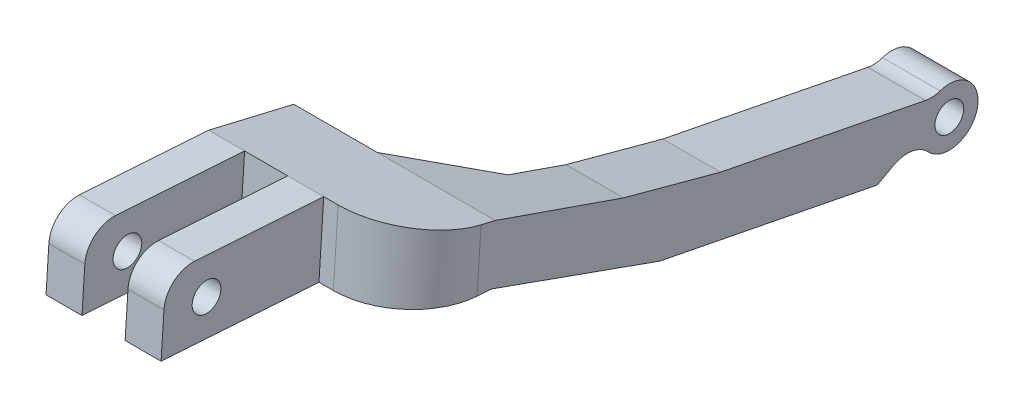
ISO-10303-21;
HEADER;
FILE_DESCRIPTION(('STEP AP214'),'2;1');
FILE_NAME('part.step','',(''),(''),'','','');
FILE_SCHEMA(('AUTOMOTIVE_DESIGN { 1 0 10303 214 1 1 1 1 }'));
ENDSEC;
DATA;
#1=APPLICATION_CONTEXT('core data for automotive mechanical design processes');
#2=APPLICATION_PROTOCOL_DEFINITION('international standard','automotive_design',2000,#1);
#3=PRODUCT_CONTEXT('',#1,'mechanical');
#4=PRODUCT('Part','Part','',(#3));
#5=PRODUCT_RELATED_PRODUCT_CATEGORY('part','',(#4));
#6=PRODUCT_DEFINITION_FORMATION('','',#4);
#7=PRODUCT_DEFINITION_CONTEXT('part definition',#1,'design');
#8=PRODUCT_DEFINITION('design','',#6,#7);
#9=PRODUCT_DEFINITION_SHAPE('','',#8);
#10=(LENGTH_UNIT() NAMED_UNIT(*) SI_UNIT(.MILLI.,.METRE.));
#11=(NAMED_UNIT(*) PLANE_ANGLE_UNIT() SI_UNIT($,.RADIAN.));
#12=(NAMED_UNIT(*) SI_UNIT($,.STERADIAN.) SOLID_ANGLE_UNIT());
#13=UNCERTAINTY_MEASURE_WITH_UNIT(LENGTH_MEASURE(1.E-05),#10,'distance_accuracy_value','');
#14=(GEOMETRIC_REPRESENTATION_CONTEXT(3) GLOBAL_UNCERTAINTY_ASSIGNED_CONTEXT((#13)) GLOBAL_UNIT_ASSIGNED_CONTEXT((#10,
#11,#12)) REPRESENTATION_CONTEXT('',''));
#15=CARTESIAN_POINT('',(0.,0.,0.));
#16=DIRECTION('',(0.,0.,1.));
#17=DIRECTION('',(1.,0.,0.));
#18=AXIS2_PLACEMENT_3D('',#15,#16,#17);
#19=CARTESIAN_POINT('',(-2.,2.73863938441032,41.0516777291584));
#20=DIRECTION('',(0.,0.0665640397080232,0.997782154890409));
#21=DIRECTION('',(0.,-0.997782154890409,0.0665640397080232));
#22=AXIS2_PLACEMENT_3D('',#19,#20,#21);
#23=PLANE('',#22);
#24=DIRECTION('',(1.,0.,0.));
#25=VECTOR('',#24,1.);
#26=CARTESIAN_POINT('',(-2.,8.79072533125629,40.64793099215));
#27=LINE('',#26,#25);
#28=CARTESIAN_POINT('',(-9.5,8.79072533125629,40.64793099215));
#29=VERTEX_POINT('',#28);
#30=CARTESIAN_POINT('',(-6.5,8.79072533125629,40.64793099215));
#31=VERTEX_POINT('',#30);
#32=EDGE_CURVE('E342',#29,#31,#27,.T.);
#33=ORIENTED_EDGE('',*,*,#32,.T.);
#34=DIRECTION('',(0.,-0.997782154890409,0.0665640397080232));
#35=VECTOR('',#34,1.);
#36=CARTESIAN_POINT('',(-6.5,2.73863938441032,41.0516777291584));
#37=LINE('',#36,#35);
#38=CARTESIAN_POINT('',(-6.5,13.7796361057083,40.3151107936098));
#39=VERTEX_POINT('',#38);
#40=EDGE_CURVE('E399',#39,#31,#37,.T.);
#41=ORIENTED_EDGE('',*,*,#40,.F.);
#42=DIRECTION('',(1.,0.,0.));
#43=VECTOR('',#42,1.);
#44=CARTESIAN_POINT('',(-2.,13.7796361057083,40.3151107936098));
#45=LINE('',#44,#43);
#46=CARTESIAN_POINT('',(-9.5,13.7796361057083,40.3151107936098));
#47=VERTEX_POINT('',#46);
#48=EDGE_CURVE('E345',#47,#39,#45,.T.);
#49=ORIENTED_EDGE('',*,*,#48,.F.);
#50=DIRECTION('',(0.,-0.997782154890409,0.0665640397080232));
#51=VECTOR('',#50,1.);
#52=CARTESIAN_POINT('',(-9.5,2.73863938441032,41.0516777291584));
#53=LINE('',#52,#51);
#54=EDGE_CURVE('E265',#47,#29,#53,.T.);
#55=ORIENTED_EDGE('',*,*,#54,.T.);
#56=EDGE_LOOP('',(#33,#41,#49,#55));
#57=FACE_BOUND('',#56,.T.);
#58=ADVANCED_FACE('F43',(#57),#23,.T.);
#59=CARTESIAN_POINT('',(-2.,0.,0.));
#60=DIRECTION('',(1.,0.,0.));
#61=DIRECTION('',(0.,0.,-1.));
#62=AXIS2_PLACEMENT_3D('',#59,#60,#61);
#63=PLANE('',#62);
#64=CARTESIAN_POINT('',(-2.,2.82842712474617,2.82842712474621));
#65=DIRECTION('',(1.,0.,0.));
#66=DIRECTION('',(0.,0.,-1.));
#67=AXIS2_PLACEMENT_3D('',#64,#65,#66);
#68=CIRCLE('',#67,1.);
#69=CARTESIAN_POINT('',(-2.,2.82842712474617,1.82842712474621));
#70=VERTEX_POINT('',#69);
#71=EDGE_CURVE('E325',#70,#70,#68,.T.);
#72=ORIENTED_EDGE('',*,*,#71,.T.);
#73=EDGE_LOOP('',(#72));
#74=FACE_BOUND('',#73,.T.);
#75=DIRECTION('',(0.,-0.335768666523311,-0.941944479564033));
#76=VECTOR('',#75,1.);
#77=CARTESIAN_POINT('',(-2.,-3.51720209807534,1.2537535746378));
#78=LINE('',#77,#76);
#79=CARTESIAN_POINT('',(-2.,6.64655444127387,29.7665223895568));
#80=VERTEX_POINT('',#79);
#81=CARTESIAN_POINT('',(-2.,4.21314419530496,22.939985025488));
#82=VERTEX_POINT('',#81);
#83=EDGE_CURVE('E312',#80,#82,#78,.T.);
#84=ORIENTED_EDGE('',*,*,#83,.F.);
#85=DIRECTION('',(0.,0.997782154890409,-0.0665640397080232));
#86=VECTOR('',#85,1.);
#87=CARTESIAN_POINT('',(-2.,12.0496495140297,29.4060711295234));
#88=LINE('',#87,#86);
#89=CARTESIAN_POINT('',(-2.,10.6823280378961,29.4972878751676));
#90=VERTEX_POINT('',#89);
#91=EDGE_CURVE('E366',#80,#90,#88,.T.);
#92=ORIENTED_EDGE('',*,*,#91,.T.);
#93=DIRECTION('',(0.,-0.327934825038129,-0.944700349596216));
#94=VECTOR('',#93,1.);
#95=CARTESIAN_POINT('',(-2.,0.395273106266088,-0.13721156872764));
#96=LINE('',#95,#94);
#97=CARTESIAN_POINT('',(-2.,9.28430122630332,25.469913175018));
#98=VERTEX_POINT('',#97);
#99=EDGE_CURVE('E310',#90,#98,#96,.T.);
#100=ORIENTED_EDGE('',*,*,#99,.T.);
#101=DIRECTION('',(0.,-0.261237027153609,-0.965274684037629));
#102=VECTOR('',#101,1.);
#103=CARTESIAN_POINT('',(-2.,2.22806298460891,-0.602991625115011));
#104=LINE('',#103,#102);
#105=CARTESIAN_POINT('',(-2.,7.46200384373997,18.7364973597243));
#106=VERTEX_POINT('',#105);
#107=EDGE_CURVE('E360',#106,#98,#104,.F.);
#108=ORIENTED_EDGE('',*,*,#107,.F.);
#109=DIRECTION('',(0.,0.193266508732253,0.981146297247483));
#110=VECTOR('',#109,1.);
#111=CARTESIAN_POINT('',(-2.,3.63041791669355,-0.715120872357937));
#112=LINE('',#111,#110);
#113=CARTESIAN_POINT('',(-2.,4.65637088782305,4.49328261863853));
#114=VERTEX_POINT('',#113);
#115=EDGE_CURVE('E307',#114,#106,#112,.T.);
#116=ORIENTED_EDGE('',*,*,#115,.F.);
#117=CARTESIAN_POINT('',(-2.,6.61866348231801,4.10674960117403));
#118=DIRECTION('',(1.,0.,0.));
#119=DIRECTION('',(0.,0.,-1.));
#120=AXIS2_PLACEMENT_3D('',#117,#118,#119);
#121=CIRCLE('',#120,2.);
#122=CARTESIAN_POINT('',(-2.,4.72354530353209,3.46758836296012));
#123=VERTEX_POINT('',#122);
#124=EDGE_CURVE('E305',#114,#123,#121,.T.);
#125=ORIENTED_EDGE('',*,*,#124,.T.);
#126=CARTESIAN_POINT('',(-2.,2.82842712474617,2.82842712474621));
#127=DIRECTION('',(1.,0.,0.));
#128=DIRECTION('',(0.,0.,-1.));
#129=AXIS2_PLACEMENT_3D('',#126,#127,#128);
#130=CIRCLE('',#129,2.);
#131=CARTESIAN_POINT('',(-2.,1.46299909190755,4.28979849682739));
#132=VERTEX_POINT('',#131);
#133=EDGE_CURVE('E322',#132,#123,#130,.T.);
#134=ORIENTED_EDGE('',*,*,#133,.F.);
#135=CARTESIAN_POINT('',(-2.,0.0975710590689317,5.75116986890858));
#136=DIRECTION('',(1.,0.,0.));
#137=DIRECTION('',(0.,0.,-1.));
#138=AXIS2_PLACEMENT_3D('',#135,#136,#137);
#139=CIRCLE('',#138,2.);
#140=CARTESIAN_POINT('',(-2.,1.84923303121626,6.71640576511889));
#141=VERTEX_POINT('',#140);
#142=EDGE_CURVE('E320',#132,#141,#139,.T.);
#143=ORIENTED_EDGE('',*,*,#142,.T.);
#144=DIRECTION('',(0.,0.482617948105157,-0.875830986073665));
#145=VECTOR('',#144,1.);
#146=CARTESIAN_POINT('',(-2.,4.25747884786671,2.34604134625321));
#147=LINE('',#146,#145);
#148=CARTESIAN_POINT('',(-2.,1.23646472846601,7.8284271247462));
#149=VERTEX_POINT('',#148);
#150=EDGE_CURVE('E317',#149,#141,#147,.T.);
#151=ORIENTED_EDGE('',*,*,#150,.F.);
#152=DIRECTION('',(0.,0.193266508732253,0.981146297247483));
#153=VECTOR('',#152,1.);
#154=CARTESIAN_POINT('',(-2.,-0.294167272296385,0.0579451625710735));
#155=LINE('',#154,#153);
#156=EDGE_CURVE('E314',#149,#82,#155,.T.);
#157=ORIENTED_EDGE('',*,*,#156,.T.);
#158=EDGE_LOOP('',(#84,#92,#100,#108,#116,#125,#134,#143,#151,#157));
#159=FACE_BOUND('',#158,.T.);
#160=ADVANCED_FACE('F420',(#74,#159),#63,.F.);
#161=CARTESIAN_POINT('',(-2.,9.28430122630331,25.469913175018));
#162=DIRECTION('',(0.,-0.965274684037629,0.261237027153608));
#163=DIRECTION('',(-1.,0.,0.));
#164=AXIS2_PLACEMENT_3D('',#161,#162,#163);
#165=PLANE('',#164);
#166=DIRECTION('',(-1.,0.,0.));
#167=VECTOR('',#166,1.);
#168=CARTESIAN_POINT('',(-2.,9.28430122630331,25.469913175018));
#169=LINE('',#168,#167);
#170=CARTESIAN_POINT('',(2.,9.28430122630332,25.469913175018));
#171=VERTEX_POINT('',#170);
#172=EDGE_CURVE('E331',#171,#98,#169,.T.);
#173=ORIENTED_EDGE('',*,*,#172,.F.);
#174=DIRECTION('',(0.,0.261237027153609,0.965274684037629));
#175=VECTOR('',#174,1.);
#176=CARTESIAN_POINT('',(2.,9.28430122630331,25.469913175018));
#177=LINE('',#176,#175);
#178=CARTESIAN_POINT('',(2.,7.46200384373997,18.7364973597243));
#179=VERTEX_POINT('',#178);
#180=EDGE_CURVE('E358',#171,#179,#177,.F.);
#181=ORIENTED_EDGE('',*,*,#180,.T.);
#182=DIRECTION('',(1.,0.,0.));
#183=VECTOR('',#182,1.);
#184=CARTESIAN_POINT('',(-2.,7.46200384373995,18.7364973597242));
#185=LINE('',#184,#183);
#186=EDGE_CURVE('E355',#106,#179,#185,.T.);
#187=ORIENTED_EDGE('',*,*,#186,.F.);
#188=ORIENTED_EDGE('',*,*,#107,.T.);
#189=EDGE_LOOP('',(#173,#181,#187,#188));
#190=FACE_BOUND('',#189,.T.);
#191=ADVANCED_FACE('F427',(#190),#165,.F.);
#192=CARTESIAN_POINT('',(-2.,6.61866348231801,4.10674960117403));
#193=DIRECTION('',(1.,0.,0.));
#194=DIRECTION('',(0.,0.,-1.));
#195=AXIS2_PLACEMENT_3D('',#192,#193,#194);
#196=CYLINDRICAL_SURFACE('',#195,2.);
#197=DIRECTION('',(1.,0.,0.));
#198=VECTOR('',#197,1.);
#199=CARTESIAN_POINT('',(-2.,4.65637088782305,4.49328261863853));
#200=LINE('',#199,#198);
#201=CARTESIAN_POINT('',(2.,4.65637088782305,4.49328261863853));
#202=VERTEX_POINT('',#201);
#203=EDGE_CURVE('E328',#114,#202,#200,.T.);
#204=ORIENTED_EDGE('',*,*,#203,.T.);
#205=CARTESIAN_POINT('',(2.,6.61866348231801,4.10674960117403));
#206=DIRECTION('',(1.,0.,0.));
#207=DIRECTION('',(0.,0.,-1.));
#208=AXIS2_PLACEMENT_3D('',#205,#206,#207);
#209=CIRCLE('',#208,2.);
#210=CARTESIAN_POINT('',(2.,4.72354530353209,3.46758836296012));
#211=VERTEX_POINT('',#210);
#212=EDGE_CURVE('E274',#202,#211,#209,.T.);
#213=ORIENTED_EDGE('',*,*,#212,.T.);
#214=DIRECTION('',(1.,0.,0.));
#215=VECTOR('',#214,1.);
#216=CARTESIAN_POINT('',(-2.,4.72354530353209,3.46758836296012));
#217=LINE('',#216,#215);
#218=EDGE_CURVE('E329',#123,#211,#217,.T.);
#219=ORIENTED_EDGE('',*,*,#218,.F.);
#220=ORIENTED_EDGE('',*,*,#124,.F.);
#221=EDGE_LOOP('',(#204,#213,#219,#220));
#222=FACE_BOUND('',#221,.T.);
#223=ADVANCED_FACE('F525',(#222),#196,.F.);
#224=CARTESIAN_POINT('',(-2.,2.82842712474617,2.82842712474621));
#225=DIRECTION('',(1.,0.,0.));
#226=DIRECTION('',(0.,0.,-1.));
#227=AXIS2_PLACEMENT_3D('',#224,#225,#226);
#228=CYLINDRICAL_SURFACE('',#227,2.);
#229=ORIENTED_EDGE('',*,*,#218,.T.);
#230=CARTESIAN_POINT('',(2.,2.82842712474617,2.82842712474621));
#231=DIRECTION('',(1.,0.,0.));
#232=DIRECTION('',(0.,0.,-1.));
#233=AXIS2_PLACEMENT_3D('',#230,#231,#232);
#234=CIRCLE('',#233,2.);
#235=CARTESIAN_POINT('',(2.,1.46299909190755,4.28979849682739));
#236=VERTEX_POINT('',#235);
#237=EDGE_CURVE('E299',#236,#211,#234,.T.);
#238=ORIENTED_EDGE('',*,*,#237,.F.);
#239=DIRECTION('',(1.,0.,0.));
#240=VECTOR('',#239,1.);
#241=CARTESIAN_POINT('',(-2.,1.46299909190755,4.28979849682739));
#242=LINE('',#241,#240);
#243=EDGE_CURVE('E332',#132,#236,#242,.T.);
#244=ORIENTED_EDGE('',*,*,#243,.F.);
#245=ORIENTED_EDGE('',*,*,#133,.T.);
#246=EDGE_LOOP('',(#229,#238,#244,#245));
#247=FACE_BOUND('',#246,.T.);
#248=ADVANCED_FACE('F521',(#247),#228,.T.);
#249=CARTESIAN_POINT('',(-2.,0.0975710590689317,5.75116986890858));
#250=DIRECTION('',(1.,0.,0.));
#251=DIRECTION('',(0.,0.,-1.));
#252=AXIS2_PLACEMENT_3D('',#249,#250,#251);
#253=CYLINDRICAL_SURFACE('',#252,2.);
#254=ORIENTED_EDGE('',*,*,#243,.T.);
#255=CARTESIAN_POINT('',(2.,0.0975710590689317,5.75116986890858));
#256=DIRECTION('',(1.,0.,0.));
#257=DIRECTION('',(0.,0.,-1.));
#258=AXIS2_PLACEMENT_3D('',#255,#256,#257);
#259=CIRCLE('',#258,2.);
#260=CARTESIAN_POINT('',(2.,1.84923303121626,6.71640576511889));
#261=VERTEX_POINT('',#260);
#262=EDGE_CURVE('E296',#236,#261,#259,.T.);
#263=ORIENTED_EDGE('',*,*,#262,.T.);
#264=DIRECTION('',(1.,0.,0.));
#265=VECTOR('',#264,1.);
#266=CARTESIAN_POINT('',(-2.,1.84923303121626,6.71640576511889));
#267=LINE('',#266,#265);
#268=EDGE_CURVE('E334',#141,#261,#267,.T.);
#269=ORIENTED_EDGE('',*,*,#268,.F.);
#270=ORIENTED_EDGE('',*,*,#142,.F.);
#271=EDGE_LOOP('',(#254,#263,#269,#270));
#272=FACE_BOUND('',#271,.T.);
#273=ADVANCED_FACE('F524',(#272),#253,.F.);
#274=CARTESIAN_POINT('',(-2.,4.25747884786671,2.34604134625321));
#275=DIRECTION('',(0.,-0.875830986073665,-0.482617948105157));
#276=DIRECTION('',(0.,0.482617948105157,-0.875830986073665));
#277=AXIS2_PLACEMENT_3D('',#274,#275,#276);
#278=PLANE('',#277);
#279=ORIENTED_EDGE('',*,*,#268,.T.);
#280=DIRECTION('',(0.,0.482617948105157,-0.875830986073665));
#281=VECTOR('',#280,1.);
#282=CARTESIAN_POINT('',(2.,4.25747884786671,2.34604134625321));
#283=LINE('',#282,#281);
#284=CARTESIAN_POINT('',(2.,1.23646472846601,7.8284271247462));
#285=VERTEX_POINT('',#284);
#286=EDGE_CURVE('E293',#285,#261,#283,.T.);
#287=ORIENTED_EDGE('',*,*,#286,.F.);
#288=DIRECTION('',(1.,0.,0.));
#289=VECTOR('',#288,1.);
#290=CARTESIAN_POINT('',(-2.,1.23646472846601,7.8284271247462));
#291=LINE('',#290,#289);
#292=EDGE_CURVE('E336',#149,#285,#291,.T.);
#293=ORIENTED_EDGE('',*,*,#292,.F.);
#294=ORIENTED_EDGE('',*,*,#150,.T.);
#295=EDGE_LOOP('',(#279,#287,#293,#294));
#296=FACE_BOUND('',#295,.T.);
#297=ADVANCED_FACE('F529',(#296),#278,.T.);
#298=CARTESIAN_POINT('',(-2.,-0.294167272296385,0.0579451625710735));
#299=DIRECTION('',(0.,0.981146297247483,-0.193266508732253));
#300=DIRECTION('',(0.,0.193266508732253,0.981146297247483));
#301=AXIS2_PLACEMENT_3D('',#298,#299,#300);
#302=PLANE('',#301);
#303=ORIENTED_EDGE('',*,*,#292,.T.);
#304=DIRECTION('',(0.,0.193266508732253,0.981146297247483));
#305=VECTOR('',#304,1.);
#306=CARTESIAN_POINT('',(2.,-0.294167272296385,0.0579451625710735));
#307=LINE('',#306,#305);
#308=CARTESIAN_POINT('',(2.,4.21314419530496,22.939985025488));
#309=VERTEX_POINT('',#308);
#310=EDGE_CURVE('E290',#285,#309,#307,.T.);
#311=ORIENTED_EDGE('',*,*,#310,.T.);
#312=DIRECTION('',(1.,0.,0.));
#313=VECTOR('',#312,1.);
#314=CARTESIAN_POINT('',(-2.,4.21314419530496,22.939985025488));
#315=LINE('',#314,#313);
#316=EDGE_CURVE('E338',#82,#309,#315,.T.);
#317=ORIENTED_EDGE('',*,*,#316,.F.);
#318=ORIENTED_EDGE('',*,*,#156,.F.);
#319=EDGE_LOOP('',(#303,#311,#317,#318));
#320=FACE_BOUND('',#319,.T.);
#321=ADVANCED_FACE('F533',(#320),#302,.F.);
#322=CARTESIAN_POINT('',(-2.,-3.51720209807534,1.2537535746378));
#323=DIRECTION('',(0.,-0.941944479564033,0.335768666523311));
#324=DIRECTION('',(0.,-0.335768666523311,-0.941944479564033));
#325=AXIS2_PLACEMENT_3D('',#322,#323,#324);
#326=PLANE('',#325);
#327=ORIENTED_EDGE('',*,*,#316,.T.);
#328=DIRECTION('',(0.,-0.335768666523311,-0.941944479564033));
#329=VECTOR('',#328,1.);
#330=CARTESIAN_POINT('',(2.,-3.51720209807534,1.2537535746378));
#331=LINE('',#330,#329);
#332=CARTESIAN_POINT('',(2.,8.39134109300816,34.6612380628075));
#333=VERTEX_POINT('',#332);
#334=EDGE_CURVE('E287',#333,#309,#331,.T.);
#335=ORIENTED_EDGE('',*,*,#334,.F.);
#336=DIRECTION('',(1.,0.,0.));
#337=VECTOR('',#336,1.);
#338=CARTESIAN_POINT('',(-2.,8.39134109300816,34.6612380628075));
#339=LINE('',#338,#337);
#340=CARTESIAN_POINT('',(-6.19549815588642,8.39134109300816,34.6612380628075));
#341=VERTEX_POINT('',#340);
#342=EDGE_CURVE('E340',#341,#333,#339,.T.);
#343=ORIENTED_EDGE('',*,*,#342,.F.);
#344=DIRECTION('',(-0.628193000253413,0.261247346758396,0.732887016015644));
#345=VECTOR('',#344,1.);
#346=CARTESIAN_POINT('',(-5.38815038264096,8.05558844440082,33.7193385189061));
#347=LINE('',#346,#345);
#348=EDGE_CURVE('E368',#341,#80,#347,.F.);
#349=ORIENTED_EDGE('',*,*,#348,.T.);
#350=ORIENTED_EDGE('',*,*,#83,.T.);
#351=EDGE_LOOP('',(#327,#335,#343,#349,#350));
#352=FACE_BOUND('',#351,.T.);
#353=ADVANCED_FACE('F441',(#352),#326,.T.);
#354=CARTESIAN_POINT('',(-2.,6.05208594684601,-0.403746737008409));
#355=DIRECTION('',(0.,0.997782154890409,-0.0665640397080224));
#356=DIRECTION('',(0.,0.0665640397080224,0.997782154890409));
#357=AXIS2_PLACEMENT_3D('',#354,#355,#356);
#358=PLANE('',#357);
#359=DIRECTION('',(0.,0.0665640397080224,0.997782154890409));
#360=VECTOR('',#359,1.);
#361=CARTESIAN_POINT('',(2.,6.05208594684601,-0.403746737008409));
#362=LINE('',#361,#360);
#363=CARTESIAN_POINT('',(2.,8.45790513271618,35.6590202176979));
#364=VERTEX_POINT('',#363);
#365=EDGE_CURVE('E285',#333,#364,#362,.T.);
#366=ORIENTED_EDGE('',*,*,#365,.T.);
#367=CARTESIAN_POINT('',(-3.,8.45790513271618,35.6590202176979));
#368=DIRECTION('',(0.,0.997782154890409,-0.0665640397080224));
#369=DIRECTION('',(0.,0.0665640397080224,0.997782154890409));
#370=AXIS2_PLACEMENT_3D('',#367,#368,#369);
#371=CIRCLE('',#370,5.);
#372=CARTESIAN_POINT('',(-3.,8.79072533125629,40.64793099215));
#373=VERTEX_POINT('',#372);
#374=EDGE_CURVE('E376',#364,#373,#371,.F.);
#375=ORIENTED_EDGE('',*,*,#374,.T.);
#376=CARTESIAN_POINT('',(-4.,8.79072533125629,40.64793099215));
#377=VERTEX_POINT('',#376);
#378=EDGE_CURVE('E219',#377,#373,#27,.T.);
#379=ORIENTED_EDGE('',*,*,#378,.F.);
#380=DIRECTION('',(0.,-0.0665640397080222,-0.99778215489041));
#381=VECTOR('',#380,1.);
#382=CARTESIAN_POINT('',(-4.,6.05208594684601,-0.403746737008409));
#383=LINE('',#382,#381);
#384=CARTESIAN_POINT('',(-4.,9.52292976804454,51.6235346959445));
#385=VERTEX_POINT('',#384);
#386=EDGE_CURVE('E203',#385,#377,#383,.T.);
#387=ORIENTED_EDGE('',*,*,#386,.F.);
#388=DIRECTION('',(-1.,0.,0.));
#389=VECTOR('',#388,1.);
#390=CARTESIAN_POINT('',(-4.,9.52292976804454,51.6235346959445));
#391=LINE('',#390,#389);
#392=CARTESIAN_POINT('',(-6.5,9.52292976804454,51.6235346959445));
#393=VERTEX_POINT('',#392);
#394=EDGE_CURVE('E217',#385,#393,#391,.T.);
#395=ORIENTED_EDGE('',*,*,#394,.T.);
#396=DIRECTION('',(0.,-0.0665640397080222,-0.99778215489041));
#397=VECTOR('',#396,1.);
#398=CARTESIAN_POINT('',(-6.5,6.05208594684601,-0.403746737008409));
#399=LINE('',#398,#397);
#400=EDGE_CURVE('E396',#393,#31,#399,.T.);
#401=ORIENTED_EDGE('',*,*,#400,.T.);
#402=ORIENTED_EDGE('',*,*,#32,.F.);
#403=DIRECTION('',(0.,0.0665640397080224,0.997782154890409));
#404=VECTOR('',#403,1.);
#405=CARTESIAN_POINT('',(-9.5,6.05208594684601,-0.403746737008409));
#406=LINE('',#405,#404);
#407=CARTESIAN_POINT('',(-9.5,9.52292976804454,51.6235346959445));
#408=VERTEX_POINT('',#407);
#409=EDGE_CURVE('E236',#29,#408,#406,.T.);
#410=ORIENTED_EDGE('',*,*,#409,.T.);
#411=DIRECTION('',(1.,0.,0.));
#412=VECTOR('',#411,1.);
#413=CARTESIAN_POINT('',(-12.,9.52292976804454,51.6235346959445));
#414=LINE('',#413,#412);
#415=CARTESIAN_POINT('',(-12.,9.52292976804454,51.6235346959445));
#416=VERTEX_POINT('',#415);
#417=EDGE_CURVE('E262',#416,#408,#414,.T.);
#418=ORIENTED_EDGE('',*,*,#417,.F.);
#419=DIRECTION('',(0.,0.0665640397080224,0.997782154890409));
#420=VECTOR('',#419,1.);
#421=CARTESIAN_POINT('',(-12.,6.05208594684601,-0.403746737008409));
#422=LINE('',#421,#420);
#423=CARTESIAN_POINT('',(-12.,8.39134109300816,34.6612380628075));
#424=VERTEX_POINT('',#423);
#425=EDGE_CURVE('E238',#424,#416,#422,.T.);
#426=ORIENTED_EDGE('',*,*,#425,.F.);
#427=DIRECTION('',(1.,0.,0.));
#428=VECTOR('',#427,1.);
#429=CARTESIAN_POINT('',(-9.5,8.39134109300816,34.6612380628075));
#430=LINE('',#429,#428);
#431=EDGE_CURVE('E268',#424,#341,#430,.T.);
#432=ORIENTED_EDGE('',*,*,#431,.T.);
#433=ORIENTED_EDGE('',*,*,#342,.T.);
#434=EDGE_LOOP('',(#366,#375,#379,#387,#395,#401,#402,#410,#418,#426,#432,#433));
#435=FACE_BOUND('',#434,.T.);
#436=ADVANCED_FACE('F216',(#435),#358,.F.);
#437=ORIENTED_EDGE('',*,*,#378,.T.);
#438=DIRECTION('',(0.,-0.997782154890409,0.0665640397080232));
#439=VECTOR('',#438,1.);
#440=CARTESIAN_POINT('',(-3.,2.73863938441032,41.0516777291584));
#441=LINE('',#440,#439);
#442=CARTESIAN_POINT('',(-3.,13.7796361057083,40.3151107936098));
#443=VERTEX_POINT('',#442);
#444=EDGE_CURVE('E378',#373,#443,#441,.F.);
#445=ORIENTED_EDGE('',*,*,#444,.T.);
#446=CARTESIAN_POINT('',(-4.,13.7796361057083,40.3151107936098));
#447=VERTEX_POINT('',#446);
#448=EDGE_CURVE('E348',#447,#443,#45,.T.);
#449=ORIENTED_EDGE('',*,*,#448,.F.);
#450=DIRECTION('',(0.,-0.997782154890409,0.0665640397080232));
#451=VECTOR('',#450,1.);
#452=CARTESIAN_POINT('',(-4.,2.73863938441032,41.0516777291584));
#453=LINE('',#452,#451);
#454=EDGE_CURVE('E220',#447,#377,#453,.T.);
#455=ORIENTED_EDGE('',*,*,#454,.T.);
#456=EDGE_LOOP('',(#437,#445,#449,#455));
#457=FACE_BOUND('',#456,.T.);
#458=ADVANCED_FACE('F423',(#457),#23,.T.);
#459=CARTESIAN_POINT('',(-2.,4.04013657737564,-0.953483134376081));
#460=DIRECTION('',(0.,-0.97326319417309,0.229692740129055));
#461=DIRECTION('',(0.,-0.229692740129055,-0.97326319417309));
#462=AXIS2_PLACEMENT_3D('',#459,#460,#461);
#463=PLANE('',#462);
#464=ORIENTED_EDGE('',*,*,#448,.T.);
#465=CARTESIAN_POINT('',(-3.,12.6153307780929,35.3816700522478));
#466=DIRECTION('',(0.,-0.97326319417309,0.229692740129055));
#467=DIRECTION('',(0.,-0.229692740129055,-0.97326319417309));
#468=AXIS2_PLACEMENT_3D('',#465,#466,#467);
#469=ELLIPSE('',#468,5.06896877524852,5.);
#470=CARTESIAN_POINT('',(2.,12.6153307780929,35.3816700522478));
#471=VERTEX_POINT('',#470);
#472=EDGE_CURVE('E380',#443,#471,#469,.F.);
#473=ORIENTED_EDGE('',*,*,#472,.T.);
#474=DIRECTION('',(0.,-0.229692740129055,-0.97326319417309));
#475=VECTOR('',#474,1.);
#476=CARTESIAN_POINT('',(2.,4.04013657737564,-0.953483134376081));
#477=LINE('',#476,#475);
#478=CARTESIAN_POINT('',(2.,12.3824697125698,34.3949819039754));
#479=VERTEX_POINT('',#478);
#480=EDGE_CURVE('E283',#471,#479,#477,.T.);
#481=ORIENTED_EDGE('',*,*,#480,.T.);
#482=DIRECTION('',(1.,0.,0.));
#483=VECTOR('',#482,1.);
#484=CARTESIAN_POINT('',(-2.,12.3824697125698,34.3949819039754));
#485=LINE('',#484,#483);
#486=CARTESIAN_POINT('',(-6.19549815588642,12.3824697125698,34.3949819039754));
#487=VERTEX_POINT('',#486);
#488=EDGE_CURVE('E349',#487,#479,#485,.T.);
#489=ORIENTED_EDGE('',*,*,#488,.F.);
#490=DIRECTION('',(1.,0.,0.));
#491=VECTOR('',#490,1.);
#492=CARTESIAN_POINT('',(-9.5,12.3824697125698,34.3949819039754));
#493=LINE('',#492,#491);
#494=CARTESIAN_POINT('',(-12.,12.3824697125698,34.3949819039754));
#495=VERTEX_POINT('',#494);
#496=EDGE_CURVE('E271',#495,#487,#493,.T.);
#497=ORIENTED_EDGE('',*,*,#496,.F.);
#498=DIRECTION('',(0.,-0.229692740129055,-0.97326319417309));
#499=VECTOR('',#498,1.);
#500=CARTESIAN_POINT('',(-12.,4.04013657737564,-0.953483134376081));
#501=LINE('',#500,#499);
#502=CARTESIAN_POINT('',(-12.,13.7796361057083,40.3151107936098));
#503=VERTEX_POINT('',#502);
#504=EDGE_CURVE('E247',#503,#495,#501,.T.);
#505=ORIENTED_EDGE('',*,*,#504,.F.);
#506=DIRECTION('',(1.,0.,0.));
#507=VECTOR('',#506,1.);
#508=CARTESIAN_POINT('',(-12.,13.7796361057083,40.3151107936098));
#509=LINE('',#508,#507);
#510=EDGE_CURVE('E253',#503,#47,#509,.T.);
#511=ORIENTED_EDGE('',*,*,#510,.T.);
#512=ORIENTED_EDGE('',*,*,#48,.T.);
#513=DIRECTION('',(-1.,0.,0.));
#514=VECTOR('',#513,1.);
#515=CARTESIAN_POINT('',(-4.,13.7796361057083,40.3151107936098));
#516=LINE('',#515,#514);
#517=EDGE_CURVE('E226',#447,#39,#516,.T.);
#518=ORIENTED_EDGE('',*,*,#517,.F.);
#519=EDGE_LOOP('',(#464,#473,#481,#489,#497,#505,#511,#512,#518));
#520=FACE_BOUND('',#519,.T.);
#521=ADVANCED_FACE('F433',(#520),#463,.F.);
#522=CARTESIAN_POINT('',(-2.,0.395273106266088,-0.13721156872764));
#523=DIRECTION('',(0.,-0.944700349596216,0.327934825038129));
#524=DIRECTION('',(0.,-0.327934825038129,-0.944700349596216));
#525=AXIS2_PLACEMENT_3D('',#522,#523,#524);
#526=PLANE('',#525);
#527=DIRECTION('',(0.,-0.327934825038129,-0.944700349596216));
#528=VECTOR('',#527,1.);
#529=CARTESIAN_POINT('',(2.,0.395273106266088,-0.13721156872764));
#530=LINE('',#529,#528);
#531=EDGE_CURVE('E280',#479,#171,#530,.T.);
#532=ORIENTED_EDGE('',*,*,#531,.T.);
#533=ORIENTED_EDGE('',*,*,#172,.T.);
#534=ORIENTED_EDGE('',*,*,#99,.F.);
#535=DIRECTION('',(0.629072484740799,-0.254919036538683,-0.734359648777236));
#536=VECTOR('',#535,1.);
#537=CARTESIAN_POINT('',(13.3397732185501,4.46619189389365,11.590113827111));
#538=LINE('',#537,#536);
#539=EDGE_CURVE('E370',#90,#487,#538,.F.);
#540=ORIENTED_EDGE('',*,*,#539,.T.);
#541=ORIENTED_EDGE('',*,*,#488,.T.);
#542=EDGE_LOOP('',(#532,#533,#534,#540,#541));
#543=FACE_BOUND('',#542,.T.);
#544=ADVANCED_FACE('F439',(#543),#526,.F.);
#545=CARTESIAN_POINT('',(-2.,3.63041791669355,-0.715120872357937));
#546=DIRECTION('',(0.,0.981146297247483,-0.193266508732253));
#547=DIRECTION('',(0.,0.193266508732253,0.981146297247483));
#548=AXIS2_PLACEMENT_3D('',#545,#546,#547);
#549=PLANE('',#548);
#550=ORIENTED_EDGE('',*,*,#115,.T.);
#551=ORIENTED_EDGE('',*,*,#186,.T.);
#552=DIRECTION('',(0.,0.193266508732253,0.981146297247483));
#553=VECTOR('',#552,1.);
#554=CARTESIAN_POINT('',(2.,3.63041791669355,-0.715120872357937));
#555=LINE('',#554,#553);
#556=EDGE_CURVE('E277',#202,#179,#555,.T.);
#557=ORIENTED_EDGE('',*,*,#556,.F.);
#558=ORIENTED_EDGE('',*,*,#203,.F.);
#559=EDGE_LOOP('',(#550,#551,#557,#558));
#560=FACE_BOUND('',#559,.T.);
#561=ADVANCED_FACE('F519',(#560),#549,.T.);
#562=CARTESIAN_POINT('',(-2.,2.82842712474617,2.82842712474621));
#563=DIRECTION('',(1.,0.,0.));
#564=DIRECTION('',(0.,0.,-1.));
#565=AXIS2_PLACEMENT_3D('',#562,#563,#564);
#566=CYLINDRICAL_SURFACE('',#565,1.);
#567=ORIENTED_EDGE('',*,*,#71,.F.);
#568=EDGE_LOOP('',(#567));
#569=FACE_BOUND('',#568,.T.);
#570=CARTESIAN_POINT('',(2.,2.82842712474617,2.82842712474621));
#571=DIRECTION('',(1.,0.,0.));
#572=DIRECTION('',(0.,0.,-1.));
#573=AXIS2_PLACEMENT_3D('',#570,#571,#572);
#574=CIRCLE('',#573,1.);
#575=CARTESIAN_POINT('',(2.,2.82842712474617,1.82842712474621));
#576=VERTEX_POINT('',#575);
#577=EDGE_CURVE('E302',#576,#576,#574,.T.);
#578=ORIENTED_EDGE('',*,*,#577,.T.);
#579=EDGE_LOOP('',(#578));
#580=FACE_BOUND('',#579,.T.);
#581=ADVANCED_FACE('F515',(#569,#580),#566,.F.);
#582=CARTESIAN_POINT('',(2.,0.,0.));
#583=DIRECTION('',(1.,0.,0.));
#584=DIRECTION('',(0.,0.,-1.));
#585=AXIS2_PLACEMENT_3D('',#582,#583,#584);
#586=PLANE('',#585);
#587=ORIENTED_EDGE('',*,*,#480,.F.);
#588=DIRECTION('',(0.,-0.997782154890409,0.0665640397080232));
#589=VECTOR('',#588,1.);
#590=CARTESIAN_POINT('',(2.,2.4058191858702,36.0627669547063));
#591=LINE('',#590,#589);
#592=EDGE_CURVE('E373',#471,#364,#591,.T.);
#593=ORIENTED_EDGE('',*,*,#592,.T.);
#594=ORIENTED_EDGE('',*,*,#365,.F.);
#595=ORIENTED_EDGE('',*,*,#334,.T.);
#596=ORIENTED_EDGE('',*,*,#310,.F.);
#597=ORIENTED_EDGE('',*,*,#286,.T.);
#598=ORIENTED_EDGE('',*,*,#262,.F.);
#599=ORIENTED_EDGE('',*,*,#237,.T.);
#600=ORIENTED_EDGE('',*,*,#212,.F.);
#601=ORIENTED_EDGE('',*,*,#556,.T.);
#602=ORIENTED_EDGE('',*,*,#180,.F.);
#603=ORIENTED_EDGE('',*,*,#531,.F.);
#604=EDGE_LOOP('',(#587,#593,#594,#595,#596,#597,#598,#599,#600,#601,#602,#603));
#605=FACE_BOUND('',#604,.T.);
#606=ORIENTED_EDGE('',*,*,#577,.F.);
#607=EDGE_LOOP('',(#606));
#608=FACE_BOUND('',#607,.T.);
#609=ADVANCED_FACE('F451',(#605,#608),#586,.T.);
#610=CARTESIAN_POINT('',(-9.5,2.33925514616218,35.0649847998159));
#611=DIRECTION('',(0.,0.0665640397080232,0.997782154890409));
#612=DIRECTION('',(0.,-0.997782154890409,0.0665640397080232));
#613=AXIS2_PLACEMENT_3D('',#610,#611,#612);
#614=PLANE('',#613);
#615=ORIENTED_EDGE('',*,*,#496,.T.);
#616=DIRECTION('',(0.,-0.997782154890409,0.0665640397080232));
#617=VECTOR('',#616,1.);
#618=CARTESIAN_POINT('',(-6.19549815588642,8.39134109300816,34.6612380628075));
#619=LINE('',#618,#617);
#620=EDGE_CURVE('E363',#487,#341,#619,.T.);
#621=ORIENTED_EDGE('',*,*,#620,.T.);
#622=ORIENTED_EDGE('',*,*,#431,.F.);
#623=DIRECTION('',(0.,-0.997782154890409,0.0665640397080232));
#624=VECTOR('',#623,1.);
#625=CARTESIAN_POINT('',(-12.,2.33925514616218,35.0649847998159));
#626=LINE('',#625,#624);
#627=EDGE_CURVE('E250',#495,#424,#626,.T.);
#628=ORIENTED_EDGE('',*,*,#627,.F.);
#629=EDGE_LOOP('',(#615,#621,#622,#628));
#630=FACE_BOUND('',#629,.T.);
#631=ADVANCED_FACE('F462',(#630),#614,.F.);
#632=CARTESIAN_POINT('',(-9.5,0.,0.));
#633=DIRECTION('',(1.,0.,0.));
#634=DIRECTION('',(0.,0.,-1.));
#635=AXIS2_PLACEMENT_3D('',#632,#633,#634);
#636=PLANE('',#635);
#637=CARTESIAN_POINT('',(-9.5,11.8176930361465,48.4637781320032));
#638=DIRECTION('',(1.,0.,0.));
#639=DIRECTION('',(0.,0.,-1.));
#640=AXIS2_PLACEMENT_3D('',#637,#638,#639);
#641=CIRCLE('',#640,0.999999999999998);
#642=CARTESIAN_POINT('',(-9.5,11.8176930361465,47.4637781320032));
#643=VERTEX_POINT('',#642);
#644=EDGE_CURVE('E225',#643,#643,#641,.T.);
#645=ORIENTED_EDGE('',*,*,#644,.F.);
#646=EDGE_LOOP('',(#645));
#647=FACE_BOUND('',#646,.T.);
#648=DIRECTION('',(0.,0.0665640397080224,0.997782154890409));
#649=VECTOR('',#648,1.);
#650=CARTESIAN_POINT('',(-9.5,11.0409967212981,-0.736566935548521));
#651=LINE('',#650,#649);
#652=CARTESIAN_POINT('',(-9.5,14.3787124630805,49.2951501876235));
#653=VERTEX_POINT('',#652);
#654=EDGE_CURVE('E242',#47,#653,#651,.T.);
#655=ORIENTED_EDGE('',*,*,#654,.T.);
#656=CARTESIAN_POINT('',(-9.5,12.3831481532997,49.4282782670396));
#657=DIRECTION('',(1.,0.,0.));
#658=DIRECTION('',(0.,0.,-1.));
#659=AXIS2_PLACEMENT_3D('',#656,#657,#658);
#660=CIRCLE('',#659,2.);
#661=CARTESIAN_POINT('',(-9.5,12.5162762327158,51.4238425768204));
#662=VERTEX_POINT('',#661);
#663=EDGE_CURVE('E385',#653,#662,#660,.T.);
#664=ORIENTED_EDGE('',*,*,#663,.T.);
#665=DIRECTION('',(0.,-0.997782154890409,0.0665640397080225));
#666=VECTOR('',#665,1.);
#667=CARTESIAN_POINT('',(-9.5,3.47084382119853,52.0272814329529));
#668=LINE('',#667,#666);
#669=EDGE_CURVE('E256',#662,#408,#668,.T.);
#670=ORIENTED_EDGE('',*,*,#669,.T.);
#671=ORIENTED_EDGE('',*,*,#409,.F.);
#672=ORIENTED_EDGE('',*,*,#54,.F.);
#673=EDGE_LOOP('',(#655,#664,#670,#671,#672));
#674=FACE_BOUND('',#673,.T.);
#675=ADVANCED_FACE('F481',(#647,#674),#636,.T.);
#676=CARTESIAN_POINT('',(-12.,3.47084382119853,52.0272814329529));
#677=DIRECTION('',(0.,0.0665640397080225,0.997782154890409));
#678=DIRECTION('',(0.,-0.997782154890409,0.0665640397080225));
#679=AXIS2_PLACEMENT_3D('',#676,#677,#678);
#680=PLANE('',#679);
#681=ORIENTED_EDGE('',*,*,#669,.F.);
#682=DIRECTION('',(1.,0.,0.));
#683=VECTOR('',#682,1.);
#684=CARTESIAN_POINT('',(-12.,12.5162762327158,51.4238425768204));
#685=LINE('',#684,#683);
#686=CARTESIAN_POINT('',(-12.,12.5162762327158,51.4238425768204));
#687=VERTEX_POINT('',#686);
#688=EDGE_CURVE('E387',#662,#687,#685,.F.);
#689=ORIENTED_EDGE('',*,*,#688,.T.);
#690=DIRECTION('',(0.,-0.997782154890409,0.0665640397080225));
#691=VECTOR('',#690,1.);
#692=CARTESIAN_POINT('',(-12.,3.47084382119853,52.0272814329529));
#693=LINE('',#692,#691);
#694=EDGE_CURVE('E241',#687,#416,#693,.T.);
#695=ORIENTED_EDGE('',*,*,#694,.T.);
#696=ORIENTED_EDGE('',*,*,#417,.T.);
#697=EDGE_LOOP('',(#681,#689,#695,#696));
#698=FACE_BOUND('',#697,.T.);
#699=ADVANCED_FACE('F472',(#698),#680,.T.);
#700=CARTESIAN_POINT('',(-12.,11.0409967212981,-0.736566935548521));
#701=DIRECTION('',(0.,0.997782154890409,-0.0665640397080224));
#702=DIRECTION('',(0.,0.0665640397080224,0.997782154890409));
#703=AXIS2_PLACEMENT_3D('',#700,#701,#702);
#704=PLANE('',#703);
#705=DIRECTION('',(0.,0.0665640397080224,0.997782154890409));
#706=VECTOR('',#705,1.);
#707=CARTESIAN_POINT('',(-12.,11.0409967212981,-0.736566935548521));
#708=LINE('',#707,#706);
#709=CARTESIAN_POINT('',(-12.,14.3787124630805,49.2951501876235));
#710=VERTEX_POINT('',#709);
#711=EDGE_CURVE('E244',#503,#710,#708,.T.);
#712=ORIENTED_EDGE('',*,*,#711,.T.);
#713=DIRECTION('',(1.,0.,0.));
#714=VECTOR('',#713,1.);
#715=CARTESIAN_POINT('',(-12.,14.3787124630805,49.2951501876235));
#716=LINE('',#715,#714);
#717=EDGE_CURVE('E382',#710,#653,#716,.T.);
#718=ORIENTED_EDGE('',*,*,#717,.T.);
#719=ORIENTED_EDGE('',*,*,#654,.F.);
#720=ORIENTED_EDGE('',*,*,#510,.F.);
#721=EDGE_LOOP('',(#712,#718,#719,#720));
#722=FACE_BOUND('',#721,.T.);
#723=ADVANCED_FACE('F478',(#722),#704,.T.);
#724=CARTESIAN_POINT('',(-12.,0.,0.));
#725=DIRECTION('',(1.,0.,0.));
#726=DIRECTION('',(0.,0.,-1.));
#727=AXIS2_PLACEMENT_3D('',#724,#725,#726);
#728=PLANE('',#727);
#729=CARTESIAN_POINT('',(-12.,11.8176930361465,48.4637781320032));
#730=DIRECTION('',(1.,0.,0.));
#731=DIRECTION('',(0.,0.,-1.));
#732=AXIS2_PLACEMENT_3D('',#729,#730,#731);
#733=CIRCLE('',#732,0.999999999999998);
#734=CARTESIAN_POINT('',(-12.,11.8176930361465,47.4637781320032));
#735=VERTEX_POINT('',#734);
#736=EDGE_CURVE('E229',#735,#735,#733,.T.);
#737=ORIENTED_EDGE('',*,*,#736,.T.);
#738=EDGE_LOOP('',(#737));
#739=FACE_BOUND('',#738,.T.);
#740=ORIENTED_EDGE('',*,*,#694,.F.);
#741=CARTESIAN_POINT('',(-12.,12.3831481532997,49.4282782670396));
#742=DIRECTION('',(1.,0.,0.));
#743=DIRECTION('',(0.,0.,-1.));
#744=AXIS2_PLACEMENT_3D('',#741,#742,#743);
#745=CIRCLE('',#744,2.);
#746=EDGE_CURVE('E389',#687,#710,#745,.F.);
#747=ORIENTED_EDGE('',*,*,#746,.T.);
#748=ORIENTED_EDGE('',*,*,#711,.F.);
#749=ORIENTED_EDGE('',*,*,#504,.T.);
#750=ORIENTED_EDGE('',*,*,#627,.T.);
#751=ORIENTED_EDGE('',*,*,#425,.T.);
#752=EDGE_LOOP('',(#740,#747,#748,#749,#750,#751));
#753=FACE_BOUND('',#752,.T.);
#754=ADVANCED_FACE('F466',(#739,#753),#728,.F.);
#755=CARTESIAN_POINT('',(-12.,11.8176930361465,48.4637781320032));
#756=DIRECTION('',(1.,0.,0.));
#757=DIRECTION('',(0.,0.,-1.));
#758=AXIS2_PLACEMENT_3D('',#755,#756,#757);
#759=CYLINDRICAL_SURFACE('',#758,0.999999999999998);
#760=ORIENTED_EDGE('',*,*,#736,.F.);
#761=EDGE_LOOP('',(#760));
#762=FACE_BOUND('',#761,.T.);
#763=ORIENTED_EDGE('',*,*,#644,.T.);
#764=EDGE_LOOP('',(#763));
#765=FACE_BOUND('',#764,.T.);
#766=ADVANCED_FACE('F497',(#762,#765),#759,.F.);
#767=CARTESIAN_POINT('',(-4.,3.47084382119853,52.0272814329529));
#768=DIRECTION('',(0.,-0.0665640397080225,-0.997782154890409));
#769=DIRECTION('',(0.,0.997782154890409,-0.0665640397080225));
#770=AXIS2_PLACEMENT_3D('',#767,#768,#769);
#771=PLANE('',#770);
#772=DIRECTION('',(0.,-0.997782154890409,0.0665640397080225));
#773=VECTOR('',#772,1.);
#774=CARTESIAN_POINT('',(-4.,3.47084382119853,52.0272814329529));
#775=LINE('',#774,#773);
#776=CARTESIAN_POINT('',(-4.,12.5162762327158,51.4238425768204));
#777=VERTEX_POINT('',#776);
#778=EDGE_CURVE('E200',#777,#385,#775,.T.);
#779=ORIENTED_EDGE('',*,*,#778,.F.);
#780=DIRECTION('',(-1.,0.,0.));
#781=VECTOR('',#780,1.);
#782=CARTESIAN_POINT('',(-4.,12.5162762327158,51.4238425768204));
#783=LINE('',#782,#781);
#784=CARTESIAN_POINT('',(-6.5,12.5162762327158,51.4238425768204));
#785=VERTEX_POINT('',#784);
#786=EDGE_CURVE('E391',#777,#785,#783,.T.);
#787=ORIENTED_EDGE('',*,*,#786,.T.);
#788=DIRECTION('',(0.,-0.997782154890409,0.0665640397080225));
#789=VECTOR('',#788,1.);
#790=CARTESIAN_POINT('',(-6.5,3.47084382119853,52.0272814329529));
#791=LINE('',#790,#789);
#792=EDGE_CURVE('E223',#785,#393,#791,.T.);
#793=ORIENTED_EDGE('',*,*,#792,.T.);
#794=ORIENTED_EDGE('',*,*,#394,.F.);
#795=EDGE_LOOP('',(#779,#787,#793,#794));
#796=FACE_BOUND('',#795,.T.);
#797=ADVANCED_FACE('F222',(#796),#771,.F.);
#798=CARTESIAN_POINT('',(-4.,11.8176930361465,48.4637781320032));
#799=DIRECTION('',(-1.,0.,0.));
#800=DIRECTION('',(0.,0.,1.));
#801=AXIS2_PLACEMENT_3D('',#798,#799,#800);
#802=CYLINDRICAL_SURFACE('',#801,0.999999999999998);
#803=CARTESIAN_POINT('',(-4.,11.8176930361465,48.4637781320032));
#804=DIRECTION('',(1.,0.,0.));
#805=DIRECTION('',(0.,0.,-1.));
#806=AXIS2_PLACEMENT_3D('',#803,#804,#805);
#807=CIRCLE('',#806,0.999999999999998);
#808=CARTESIAN_POINT('',(-4.,11.8176930361465,47.4637781320032));
#809=VERTEX_POINT('',#808);
#810=EDGE_CURVE('E210',#809,#809,#807,.T.);
#811=ORIENTED_EDGE('',*,*,#810,.T.);
#812=EDGE_LOOP('',(#811));
#813=FACE_BOUND('',#812,.T.);
#814=CARTESIAN_POINT('',(-6.5,11.8176930361465,48.4637781320032));
#815=DIRECTION('',(1.,0.,0.));
#816=DIRECTION('',(0.,0.,-1.));
#817=AXIS2_PLACEMENT_3D('',#814,#815,#816);
#818=CIRCLE('',#817,0.999999999999998);
#819=CARTESIAN_POINT('',(-6.5,11.8176930361465,47.4637781320032));
#820=VERTEX_POINT('',#819);
#821=EDGE_CURVE('E397',#820,#820,#818,.T.);
#822=ORIENTED_EDGE('',*,*,#821,.F.);
#823=EDGE_LOOP('',(#822));
#824=FACE_BOUND('',#823,.T.);
#825=ADVANCED_FACE('F485',(#813,#824),#802,.F.);
#826=CARTESIAN_POINT('',(-4.,11.0409967212981,-0.736566935548521));
#827=DIRECTION('',(0.,-0.997782154890409,0.0665640397080224));
#828=DIRECTION('',(0.,-0.0665640397080224,-0.997782154890409));
#829=AXIS2_PLACEMENT_3D('',#826,#827,#828);
#830=PLANE('',#829);
#831=DIRECTION('',(0.,0.0665640397080224,0.997782154890409));
#832=VECTOR('',#831,1.);
#833=CARTESIAN_POINT('',(-6.5,11.0409967212981,-0.736566935548521));
#834=LINE('',#833,#832);
#835=CARTESIAN_POINT('',(-6.5,14.3787124630805,49.2951501876235));
#836=VERTEX_POINT('',#835);
#837=EDGE_CURVE('E405',#39,#836,#834,.T.);
#838=ORIENTED_EDGE('',*,*,#837,.T.);
#839=DIRECTION('',(-1.,0.,0.));
#840=VECTOR('',#839,1.);
#841=CARTESIAN_POINT('',(-4.,14.3787124630805,49.2951501876235));
#842=LINE('',#841,#840);
#843=CARTESIAN_POINT('',(-4.,14.3787124630805,49.2951501876235));
#844=VERTEX_POINT('',#843);
#845=EDGE_CURVE('E51',#836,#844,#842,.F.);
#846=ORIENTED_EDGE('',*,*,#845,.T.);
#847=DIRECTION('',(0.,0.0665640397080224,0.997782154890409));
#848=VECTOR('',#847,1.);
#849=CARTESIAN_POINT('',(-4.,11.0409967212981,-0.736566935548521));
#850=LINE('',#849,#848);
#851=EDGE_CURVE('E231',#447,#844,#850,.T.);
#852=ORIENTED_EDGE('',*,*,#851,.F.);
#853=ORIENTED_EDGE('',*,*,#517,.T.);
#854=EDGE_LOOP('',(#838,#846,#852,#853));
#855=FACE_BOUND('',#854,.T.);
#856=ADVANCED_FACE('F483',(#855),#830,.F.);
#857=CARTESIAN_POINT('',(-4.,0.,0.));
#858=DIRECTION('',(1.,0.,0.));
#859=DIRECTION('',(0.,0.,-1.));
#860=AXIS2_PLACEMENT_3D('',#857,#858,#859);
#861=PLANE('',#860);
#862=ORIENTED_EDGE('',*,*,#810,.F.);
#863=EDGE_LOOP('',(#862));
#864=FACE_BOUND('',#863,.T.);
#865=ORIENTED_EDGE('',*,*,#851,.T.);
#866=CARTESIAN_POINT('',(-4.,12.3831481532997,49.4282782670396));
#867=DIRECTION('',(1.,0.,0.));
#868=DIRECTION('',(0.,0.,-1.));
#869=AXIS2_PLACEMENT_3D('',#866,#867,#868);
#870=CIRCLE('',#869,2.);
#871=EDGE_CURVE('E12',#844,#777,#870,.T.);
#872=ORIENTED_EDGE('',*,*,#871,.T.);
#873=ORIENTED_EDGE('',*,*,#778,.T.);
#874=ORIENTED_EDGE('',*,*,#386,.T.);
#875=ORIENTED_EDGE('',*,*,#454,.F.);
#876=EDGE_LOOP('',(#865,#872,#873,#874,#875));
#877=FACE_BOUND('',#876,.T.);
#878=ADVANCED_FACE('F202',(#864,#877),#861,.T.);
#879=CARTESIAN_POINT('',(-6.5,0.,0.));
#880=DIRECTION('',(1.,0.,0.));
#881=DIRECTION('',(0.,0.,-1.));
#882=AXIS2_PLACEMENT_3D('',#879,#880,#881);
#883=PLANE('',#882);
#884=ORIENTED_EDGE('',*,*,#821,.T.);
#885=EDGE_LOOP('',(#884));
#886=FACE_BOUND('',#885,.T.);
#887=ORIENTED_EDGE('',*,*,#792,.F.);
#888=CARTESIAN_POINT('',(-6.5,12.3831481532997,49.4282782670396));
#889=DIRECTION('',(1.,0.,0.));
#890=DIRECTION('',(0.,0.,-1.));
#891=AXIS2_PLACEMENT_3D('',#888,#889,#890);
#892=CIRCLE('',#891,2.);
#893=EDGE_CURVE('E65',#785,#836,#892,.F.);
#894=ORIENTED_EDGE('',*,*,#893,.T.);
#895=ORIENTED_EDGE('',*,*,#837,.F.);
#896=ORIENTED_EDGE('',*,*,#40,.T.);
#897=ORIENTED_EDGE('',*,*,#400,.F.);
#898=EDGE_LOOP('',(#887,#894,#895,#896,#897));
#899=FACE_BOUND('',#898,.T.);
#900=ADVANCED_FACE('F394',(#886,#899),#883,.F.);
#901=CARTESIAN_POINT('',(-6.19549815588642,2.33925514616218,35.0649847998159));
#902=DIRECTION('',(-0.766044443118975,-0.0427865399750004,-0.641362006329894));
#903=DIRECTION('',(0.,0.997782154890409,-0.0665640397080232));
#904=AXIS2_PLACEMENT_3D('',#901,#902,#903);
#905=PLANE('',#904);
#906=ORIENTED_EDGE('',*,*,#539,.F.);
#907=ORIENTED_EDGE('',*,*,#91,.F.);
#908=ORIENTED_EDGE('',*,*,#348,.F.);
#909=ORIENTED_EDGE('',*,*,#620,.F.);
#910=EDGE_LOOP('',(#906,#907,#908,#909));
#911=FACE_BOUND('',#910,.T.);
#912=ADVANCED_FACE('F566',(#911),#905,.T.);
#913=CARTESIAN_POINT('',(-3.,2.4058191858702,36.0627669547063));
#914=DIRECTION('',(0.,-0.997782154890409,0.0665640397080232));
#915=DIRECTION('',(0.,-0.0665640397080232,-0.997782154890409));
#916=AXIS2_PLACEMENT_3D('',#913,#914,#915);
#917=CYLINDRICAL_SURFACE('',#916,5.);
#918=ORIENTED_EDGE('',*,*,#472,.F.);
#919=ORIENTED_EDGE('',*,*,#444,.F.);
#920=ORIENTED_EDGE('',*,*,#374,.F.);
#921=ORIENTED_EDGE('',*,*,#592,.F.);
#922=EDGE_LOOP('',(#918,#919,#920,#921));
#923=FACE_BOUND('',#922,.T.);
#924=ADVANCED_FACE('F417',(#923),#917,.T.);
#925=CARTESIAN_POINT('',(-12.,12.3831481532997,49.4282782670396));
#926=DIRECTION('',(1.,0.,0.));
#927=DIRECTION('',(0.,0.,-1.));
#928=AXIS2_PLACEMENT_3D('',#925,#926,#927);
#929=CYLINDRICAL_SURFACE('',#928,2.);
#930=ORIENTED_EDGE('',*,*,#746,.F.);
#931=ORIENTED_EDGE('',*,*,#688,.F.);
#932=ORIENTED_EDGE('',*,*,#663,.F.);
#933=ORIENTED_EDGE('',*,*,#717,.F.);
#934=EDGE_LOOP('',(#930,#931,#932,#933));
#935=FACE_BOUND('',#934,.T.);
#936=ADVANCED_FACE('F413',(#935),#929,.T.);
#937=CARTESIAN_POINT('',(-4.,12.3831481532997,49.4282782670396));
#938=DIRECTION('',(-1.,0.,0.));
#939=DIRECTION('',(0.,0.,1.));
#940=AXIS2_PLACEMENT_3D('',#937,#938,#939);
#941=CYLINDRICAL_SURFACE('',#940,2.);
#942=ORIENTED_EDGE('',*,*,#871,.F.);
#943=ORIENTED_EDGE('',*,*,#845,.F.);
#944=ORIENTED_EDGE('',*,*,#893,.F.);
#945=ORIENTED_EDGE('',*,*,#786,.F.);
#946=EDGE_LOOP('',(#942,#943,#944,#945));
#947=FACE_BOUND('',#946,.T.);
#948=ADVANCED_FACE('F45',(#947),#941,.T.);
#949=CLOSED_SHELL('',(#58,#160,#191,#223,#248,#273,#297,#321,#353,#436,#458,#521,#544,#561,#581,
#609,#631,#675,#699,#723,#754,#766,#797,#825,#856,#878,#900,#912,#924,#936,#948));
#950=MANIFOLD_SOLID_BREP('B2',#949);
#951=ADVANCED_BREP_SHAPE_REPRESENTATION('',(#18,#950),#14);
#952=SHAPE_DEFINITION_REPRESENTATION(#9,#951);
ENDSEC;
END-ISO-10303-21;
